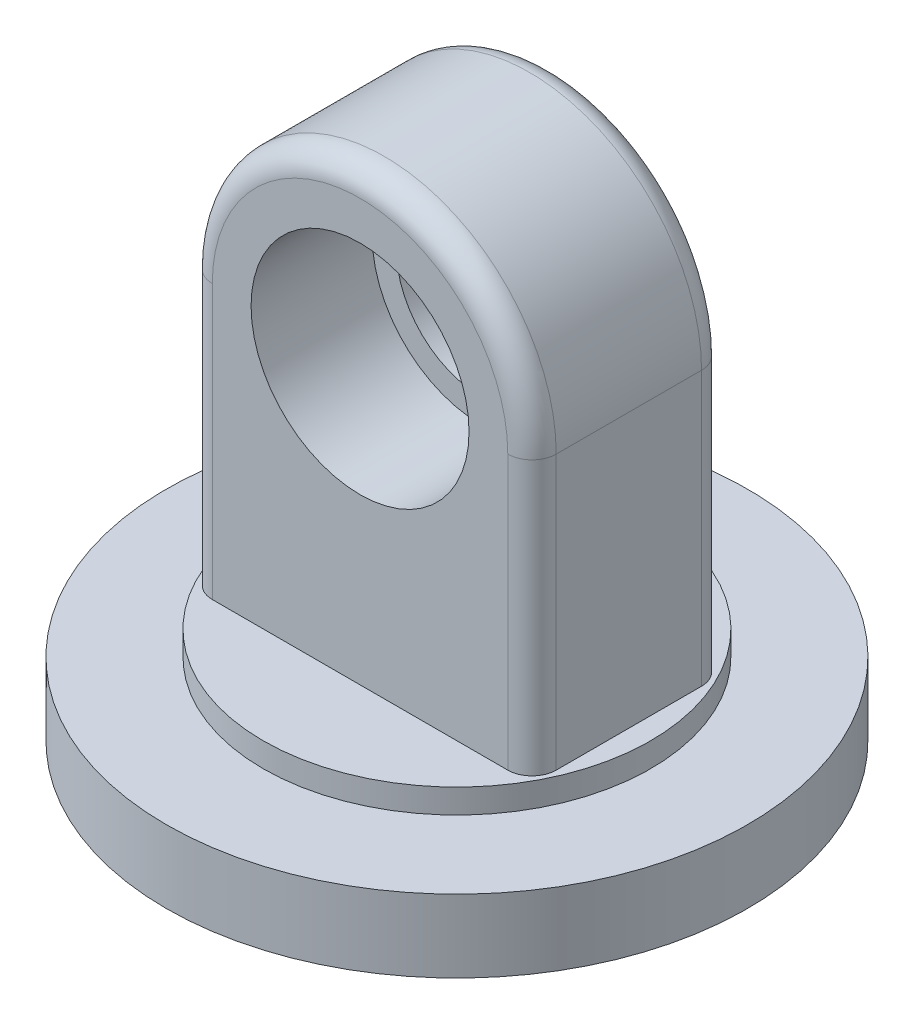
ISO-10303-21;
HEADER;
FILE_DESCRIPTION(('STEP AP214'),'2;1');
FILE_NAME('part.step','',(''),(''),'','','');
FILE_SCHEMA(('AUTOMOTIVE_DESIGN { 1 0 10303 214 1 1 1 1 }'));
ENDSEC;
DATA;
#1=APPLICATION_CONTEXT('core data for automotive mechanical design processes');
#2=APPLICATION_PROTOCOL_DEFINITION('international standard','automotive_design',2000,#1);
#3=PRODUCT_CONTEXT('',#1,'mechanical');
#4=PRODUCT('Part','Part','',(#3));
#5=PRODUCT_RELATED_PRODUCT_CATEGORY('part','',(#4));
#6=PRODUCT_DEFINITION_FORMATION('','',#4);
#7=PRODUCT_DEFINITION_CONTEXT('part definition',#1,'design');
#8=PRODUCT_DEFINITION('design','',#6,#7);
#9=PRODUCT_DEFINITION_SHAPE('','',#8);
#10=(LENGTH_UNIT() NAMED_UNIT(*) SI_UNIT(.MILLI.,.METRE.));
#11=(NAMED_UNIT(*) PLANE_ANGLE_UNIT() SI_UNIT($,.RADIAN.));
#12=(NAMED_UNIT(*) SI_UNIT($,.STERADIAN.) SOLID_ANGLE_UNIT());
#13=UNCERTAINTY_MEASURE_WITH_UNIT(LENGTH_MEASURE(1.E-05),#10,'distance_accuracy_value','');
#14=(GEOMETRIC_REPRESENTATION_CONTEXT(3) GLOBAL_UNCERTAINTY_ASSIGNED_CONTEXT((#13)) GLOBAL_UNIT_ASSIGNED_CONTEXT((#10,
#11,#12)) REPRESENTATION_CONTEXT('',''));
#15=CARTESIAN_POINT('',(0.,0.,0.));
#16=DIRECTION('',(0.,0.,1.));
#17=DIRECTION('',(1.,0.,0.));
#18=AXIS2_PLACEMENT_3D('',#15,#16,#17);
#19=CARTESIAN_POINT('',(0.,7.65,2.));
#20=DIRECTION('',(0.,0.,-1.));
#21=DIRECTION('',(-1.,0.,0.));
#22=AXIS2_PLACEMENT_3D('',#19,#20,#21);
#23=CYLINDRICAL_SURFACE('',#22,1.75);
#24=CARTESIAN_POINT('',(0.,7.65,-2.));
#25=DIRECTION('',(0.,0.,1.));
#26=DIRECTION('',(1.,0.,0.));
#27=AXIS2_PLACEMENT_3D('',#24,#25,#26);
#28=CIRCLE('',#27,1.75);
#29=CARTESIAN_POINT('',(1.75,7.65,-2.));
#30=VERTEX_POINT('',#29);
#31=EDGE_CURVE('E155',#30,#30,#28,.T.);
#32=ORIENTED_EDGE('',*,*,#31,.F.);
#33=EDGE_LOOP('',(#32));
#34=FACE_BOUND('',#33,.T.);
#35=CARTESIAN_POINT('',(0.,7.65,-0.5));
#36=DIRECTION('',(0.,0.,1.));
#37=DIRECTION('',(1.,0.,0.));
#38=AXIS2_PLACEMENT_3D('',#35,#36,#37);
#39=CIRCLE('',#38,1.75);
#40=CARTESIAN_POINT('',(1.75,7.65,-0.5));
#41=VERTEX_POINT('',#40);
#42=EDGE_CURVE('E151',#41,#41,#39,.T.);
#43=ORIENTED_EDGE('',*,*,#42,.T.);
#44=EDGE_LOOP('',(#43));
#45=FACE_BOUND('',#44,.T.);
#46=ADVANCED_FACE('F35',(#34,#45),#23,.F.);
#47=CARTESIAN_POINT('',(0.,1.5,0.));
#48=DIRECTION('',(0.,-1.,0.));
#49=DIRECTION('',(0.,0.,-1.));
#50=AXIS2_PLACEMENT_3D('',#47,#48,#49);
#51=CYLINDRICAL_SURFACE('',#50,6.);
#52=CARTESIAN_POINT('',(0.,1.5,0.));
#53=DIRECTION('',(0.,1.,0.));
#54=DIRECTION('',(0.,0.,1.));
#55=AXIS2_PLACEMENT_3D('',#52,#53,#54);
#56=CIRCLE('',#55,6.);
#57=CARTESIAN_POINT('',(0.,1.5,6.));
#58=VERTEX_POINT('',#57);
#59=EDGE_CURVE('E192',#58,#58,#56,.T.);
#60=ORIENTED_EDGE('',*,*,#59,.F.);
#61=EDGE_LOOP('',(#60));
#62=FACE_BOUND('',#61,.T.);
#63=CARTESIAN_POINT('',(0.,0.,0.));
#64=DIRECTION('',(0.,1.,0.));
#65=DIRECTION('',(0.,0.,1.));
#66=AXIS2_PLACEMENT_3D('',#63,#64,#65);
#67=CIRCLE('',#66,6.);
#68=CARTESIAN_POINT('',(0.,0.,6.));
#69=VERTEX_POINT('',#68);
#70=EDGE_CURVE('E189',#69,#69,#67,.T.);
#71=ORIENTED_EDGE('',*,*,#70,.T.);
#72=EDGE_LOOP('',(#71));
#73=FACE_BOUND('',#72,.T.);
#74=ADVANCED_FACE('F242',(#62,#73),#51,.T.);
#75=CARTESIAN_POINT('',(0.,1.5,0.));
#76=DIRECTION('',(0.,1.,0.));
#77=DIRECTION('',(0.,0.,1.));
#78=AXIS2_PLACEMENT_3D('',#75,#76,#77);
#79=PLANE('',#78);
#80=CARTESIAN_POINT('',(0.,1.5,0.));
#81=DIRECTION('',(0.,1.,0.));
#82=DIRECTION('',(0.,0.,1.));
#83=AXIS2_PLACEMENT_3D('',#80,#81,#82);
#84=CIRCLE('',#83,4.);
#85=CARTESIAN_POINT('',(0.,1.5,4.));
#86=VERTEX_POINT('',#85);
#87=EDGE_CURVE('E186',#86,#86,#84,.T.);
#88=ORIENTED_EDGE('',*,*,#87,.F.);
#89=EDGE_LOOP('',(#88));
#90=FACE_BOUND('',#89,.T.);
#91=ORIENTED_EDGE('',*,*,#59,.T.);
#92=EDGE_LOOP('',(#91));
#93=FACE_BOUND('',#92,.T.);
#94=ADVANCED_FACE('F248',(#90,#93),#79,.T.);
#95=CARTESIAN_POINT('',(0.,0.,0.));
#96=DIRECTION('',(0.,1.,0.));
#97=DIRECTION('',(0.,0.,1.));
#98=AXIS2_PLACEMENT_3D('',#95,#96,#97);
#99=PLANE('',#98);
#100=CARTESIAN_POINT('',(0.,0.,0.));
#101=DIRECTION('',(0.,-1.,0.));
#102=DIRECTION('',(0.,0.,-1.));
#103=AXIS2_PLACEMENT_3D('',#100,#101,#102);
#104=CIRCLE('',#103,4.5);
#105=CARTESIAN_POINT('',(0.,0.,-4.5));
#106=VERTEX_POINT('',#105);
#107=EDGE_CURVE('E167',#106,#106,#104,.T.);
#108=ORIENTED_EDGE('',*,*,#107,.F.);
#109=EDGE_LOOP('',(#108));
#110=FACE_BOUND('',#109,.T.);
#111=ORIENTED_EDGE('',*,*,#70,.F.);
#112=EDGE_LOOP('',(#111));
#113=FACE_BOUND('',#112,.T.);
#114=ADVANCED_FACE('F290',(#110,#113),#99,.F.);
#115=CARTESIAN_POINT('',(0.,2.,0.));
#116=DIRECTION('',(0.,-1.,0.));
#117=DIRECTION('',(0.,0.,-1.));
#118=AXIS2_PLACEMENT_3D('',#115,#116,#117);
#119=CYLINDRICAL_SURFACE('',#118,4.);
#120=CARTESIAN_POINT('',(0.,2.,0.));
#121=DIRECTION('',(0.,1.,0.));
#122=DIRECTION('',(0.,0.,1.));
#123=AXIS2_PLACEMENT_3D('',#120,#121,#122);
#124=CIRCLE('',#123,4.);
#125=CARTESIAN_POINT('',(0.,2.,4.));
#126=VERTEX_POINT('',#125);
#127=EDGE_CURVE('E183',#126,#126,#124,.T.);
#128=ORIENTED_EDGE('',*,*,#127,.F.);
#129=EDGE_LOOP('',(#128));
#130=FACE_BOUND('',#129,.T.);
#131=ORIENTED_EDGE('',*,*,#87,.T.);
#132=EDGE_LOOP('',(#131));
#133=FACE_BOUND('',#132,.T.);
#134=ADVANCED_FACE('F286',(#130,#133),#119,.T.);
#135=CARTESIAN_POINT('',(0.,2.,0.));
#136=DIRECTION('',(0.,1.,0.));
#137=DIRECTION('',(0.,0.,1.));
#138=AXIS2_PLACEMENT_3D('',#135,#136,#137);
#139=PLANE('',#138);
#140=ORIENTED_EDGE('',*,*,#127,.T.);
#141=EDGE_LOOP('',(#140));
#142=FACE_BOUND('',#141,.T.);
#143=DIRECTION('',(1.,0.,0.));
#144=VECTOR('',#143,1.);
#145=CARTESIAN_POINT('',(-3.55,2.,2.));
#146=LINE('',#145,#144);
#147=CARTESIAN_POINT('',(-3.05,2.,2.));
#148=VERTEX_POINT('',#147);
#149=CARTESIAN_POINT('',(3.05,2.,2.));
#150=VERTEX_POINT('',#149);
#151=EDGE_CURVE('E159',#148,#150,#146,.T.);
#152=ORIENTED_EDGE('',*,*,#151,.F.);
#153=CARTESIAN_POINT('',(-3.05,2.,1.5));
#154=DIRECTION('',(0.,1.,0.));
#155=DIRECTION('',(0.,0.,1.));
#156=AXIS2_PLACEMENT_3D('',#153,#154,#155);
#157=CIRCLE('',#156,0.5);
#158=CARTESIAN_POINT('',(-3.55,2.,1.5));
#159=VERTEX_POINT('',#158);
#160=EDGE_CURVE('E124',#148,#159,#157,.F.);
#161=ORIENTED_EDGE('',*,*,#160,.T.);
#162=DIRECTION('',(0.,0.,-1.));
#163=VECTOR('',#162,1.);
#164=CARTESIAN_POINT('',(-3.55,2.,2.));
#165=LINE('',#164,#163);
#166=CARTESIAN_POINT('',(-3.55,2.,-1.5));
#167=VERTEX_POINT('',#166);
#168=EDGE_CURVE('E162',#159,#167,#165,.T.);
#169=ORIENTED_EDGE('',*,*,#168,.T.);
#170=CARTESIAN_POINT('',(-3.05,2.,-1.5));
#171=DIRECTION('',(0.,1.,0.));
#172=DIRECTION('',(0.,0.,1.));
#173=AXIS2_PLACEMENT_3D('',#170,#171,#172);
#174=CIRCLE('',#173,0.5);
#175=CARTESIAN_POINT('',(-3.05,2.,-2.));
#176=VERTEX_POINT('',#175);
#177=EDGE_CURVE('E83',#167,#176,#174,.F.);
#178=ORIENTED_EDGE('',*,*,#177,.T.);
#179=DIRECTION('',(1.,0.,0.));
#180=VECTOR('',#179,1.);
#181=CARTESIAN_POINT('',(-3.55,2.,-2.));
#182=LINE('',#181,#180);
#183=CARTESIAN_POINT('',(3.05,2.,-2.));
#184=VERTEX_POINT('',#183);
#185=EDGE_CURVE('E163',#176,#184,#182,.T.);
#186=ORIENTED_EDGE('',*,*,#185,.T.);
#187=CARTESIAN_POINT('',(3.05,2.,-1.5));
#188=DIRECTION('',(0.,1.,0.));
#189=DIRECTION('',(0.,0.,1.));
#190=AXIS2_PLACEMENT_3D('',#187,#188,#189);
#191=CIRCLE('',#190,0.5);
#192=CARTESIAN_POINT('',(3.55,2.,-1.5));
#193=VERTEX_POINT('',#192);
#194=EDGE_CURVE('E45',#184,#193,#191,.F.);
#195=ORIENTED_EDGE('',*,*,#194,.T.);
#196=DIRECTION('',(0.,0.,-1.));
#197=VECTOR('',#196,1.);
#198=CARTESIAN_POINT('',(3.55,2.,2.));
#199=LINE('',#198,#197);
#200=CARTESIAN_POINT('',(3.55,2.,1.5));
#201=VERTEX_POINT('',#200);
#202=EDGE_CURVE('E161',#201,#193,#199,.T.);
#203=ORIENTED_EDGE('',*,*,#202,.F.);
#204=CARTESIAN_POINT('',(3.05,2.,1.5));
#205=DIRECTION('',(0.,1.,0.));
#206=DIRECTION('',(0.,0.,1.));
#207=AXIS2_PLACEMENT_3D('',#204,#205,#206);
#208=CIRCLE('',#207,0.5);
#209=EDGE_CURVE('E11',#201,#150,#208,.F.);
#210=ORIENTED_EDGE('',*,*,#209,.T.);
#211=EDGE_LOOP('',(#152,#161,#169,#178,#186,#195,#203,#210));
#212=FACE_BOUND('',#211,.T.);
#213=ADVANCED_FACE('F226',(#142,#212),#139,.T.);
#214=CARTESIAN_POINT('',(0.,-0.5,0.));
#215=DIRECTION('',(0.,1.,0.));
#216=DIRECTION('',(0.,0.,1.));
#217=AXIS2_PLACEMENT_3D('',#214,#215,#216);
#218=CYLINDRICAL_SURFACE('',#217,4.5);
#219=CARTESIAN_POINT('',(0.,-0.5,0.));
#220=DIRECTION('',(0.,-1.,0.));
#221=DIRECTION('',(0.,0.,-1.));
#222=AXIS2_PLACEMENT_3D('',#219,#220,#221);
#223=CIRCLE('',#222,4.5);
#224=CARTESIAN_POINT('',(0.,-0.5,-4.5));
#225=VERTEX_POINT('',#224);
#226=EDGE_CURVE('E178',#225,#225,#223,.T.);
#227=ORIENTED_EDGE('',*,*,#226,.F.);
#228=EDGE_LOOP('',(#227));
#229=FACE_BOUND('',#228,.T.);
#230=ORIENTED_EDGE('',*,*,#107,.T.);
#231=EDGE_LOOP('',(#230));
#232=FACE_BOUND('',#231,.T.);
#233=ADVANCED_FACE('F279',(#229,#232),#218,.T.);
#234=CARTESIAN_POINT('',(0.,-0.5,0.));
#235=DIRECTION('',(0.,-1.,0.));
#236=DIRECTION('',(0.,0.,-1.));
#237=AXIS2_PLACEMENT_3D('',#234,#235,#236);
#238=PLANE('',#237);
#239=CARTESIAN_POINT('',(0.,-0.5,0.));
#240=DIRECTION('',(0.,-1.,0.));
#241=DIRECTION('',(0.,0.,-1.));
#242=AXIS2_PLACEMENT_3D('',#239,#240,#241);
#243=CIRCLE('',#242,3.5);
#244=CARTESIAN_POINT('',(0.,-0.5,-3.5));
#245=VERTEX_POINT('',#244);
#246=EDGE_CURVE('E173',#245,#245,#243,.T.);
#247=ORIENTED_EDGE('',*,*,#246,.F.);
#248=EDGE_LOOP('',(#247));
#249=FACE_BOUND('',#248,.T.);
#250=ORIENTED_EDGE('',*,*,#226,.T.);
#251=EDGE_LOOP('',(#250));
#252=FACE_BOUND('',#251,.T.);
#253=ADVANCED_FACE('F275',(#249,#252),#238,.T.);
#254=CARTESIAN_POINT('',(0.,0.,0.));
#255=DIRECTION('',(0.,-1.,0.));
#256=DIRECTION('',(0.,0.,-1.));
#257=AXIS2_PLACEMENT_3D('',#254,#255,#256);
#258=CYLINDRICAL_SURFACE('',#257,3.5);
#259=CARTESIAN_POINT('',(0.,0.,0.));
#260=DIRECTION('',(0.,-1.,0.));
#261=DIRECTION('',(0.,0.,-1.));
#262=AXIS2_PLACEMENT_3D('',#259,#260,#261);
#263=CIRCLE('',#262,3.5);
#264=CARTESIAN_POINT('',(0.,0.,-3.5));
#265=VERTEX_POINT('',#264);
#266=EDGE_CURVE('E175',#265,#265,#263,.T.);
#267=ORIENTED_EDGE('',*,*,#266,.F.);
#268=EDGE_LOOP('',(#267));
#269=FACE_BOUND('',#268,.T.);
#270=ORIENTED_EDGE('',*,*,#246,.T.);
#271=EDGE_LOOP('',(#270));
#272=FACE_BOUND('',#271,.T.);
#273=ADVANCED_FACE('F271',(#269,#272),#258,.F.);
#274=CARTESIAN_POINT('',(0.,0.,0.));
#275=DIRECTION('',(0.,-1.,0.));
#276=DIRECTION('',(0.,0.,-1.));
#277=AXIS2_PLACEMENT_3D('',#274,#275,#276);
#278=PLANE('',#277);
#279=CARTESIAN_POINT('',(0.,0.,0.));
#280=DIRECTION('',(0.,-1.,0.));
#281=DIRECTION('',(0.,0.,-1.));
#282=AXIS2_PLACEMENT_3D('',#279,#280,#281);
#283=CIRCLE('',#282,1.2);
#284=CARTESIAN_POINT('',(0.,0.,-1.2));
#285=VERTEX_POINT('',#284);
#286=EDGE_CURVE('E470',#285,#285,#283,.T.);
#287=ORIENTED_EDGE('',*,*,#286,.F.);
#288=EDGE_LOOP('',(#287));
#289=FACE_BOUND('',#288,.T.);
#290=ORIENTED_EDGE('',*,*,#266,.T.);
#291=EDGE_LOOP('',(#290));
#292=FACE_BOUND('',#291,.T.);
#293=ADVANCED_FACE('F259',(#289,#292),#278,.T.);
#294=CARTESIAN_POINT('',(0.,7.65,2.));
#295=DIRECTION('',(0.,0.,-1.));
#296=DIRECTION('',(-1.,0.,0.));
#297=AXIS2_PLACEMENT_3D('',#294,#295,#296);
#298=PLANE('',#297);
#299=CARTESIAN_POINT('',(0.,7.65,2.));
#300=DIRECTION('',(0.,0.,1.));
#301=DIRECTION('',(1.,0.,0.));
#302=AXIS2_PLACEMENT_3D('',#299,#300,#301);
#303=CIRCLE('',#302,2.25);
#304=CARTESIAN_POINT('',(2.25,7.65,2.));
#305=VERTEX_POINT('',#304);
#306=EDGE_CURVE('E140',#305,#305,#303,.T.);
#307=ORIENTED_EDGE('',*,*,#306,.F.);
#308=EDGE_LOOP('',(#307));
#309=FACE_BOUND('',#308,.T.);
#310=CARTESIAN_POINT('',(0.,7.65,2.));
#311=DIRECTION('',(0.,0.,-1.));
#312=DIRECTION('',(-1.,0.,0.));
#313=AXIS2_PLACEMENT_3D('',#310,#311,#312);
#314=CIRCLE('',#313,3.05);
#315=CARTESIAN_POINT('',(3.05,7.65,2.));
#316=VERTEX_POINT('',#315);
#317=CARTESIAN_POINT('',(-3.05,7.65,2.));
#318=VERTEX_POINT('',#317);
#319=EDGE_CURVE('E105',#316,#318,#314,.F.);
#320=ORIENTED_EDGE('',*,*,#319,.T.);
#321=DIRECTION('',(0.,-1.,0.));
#322=VECTOR('',#321,1.);
#323=CARTESIAN_POINT('',(-3.05,7.65,2.));
#324=LINE('',#323,#322);
#325=EDGE_CURVE('E109',#318,#148,#324,.T.);
#326=ORIENTED_EDGE('',*,*,#325,.T.);
#327=ORIENTED_EDGE('',*,*,#151,.T.);
#328=DIRECTION('',(0.,1.,0.));
#329=VECTOR('',#328,1.);
#330=CARTESIAN_POINT('',(3.05,7.65,2.));
#331=LINE('',#330,#329);
#332=EDGE_CURVE('E101',#150,#316,#331,.T.);
#333=ORIENTED_EDGE('',*,*,#332,.T.);
#334=EDGE_LOOP('',(#320,#326,#327,#333));
#335=FACE_BOUND('',#334,.T.);
#336=ADVANCED_FACE('F107',(#309,#335),#298,.F.);
#337=CARTESIAN_POINT('',(0.,7.65,-2.));
#338=DIRECTION('',(0.,0.,-1.));
#339=DIRECTION('',(-1.,0.,0.));
#340=AXIS2_PLACEMENT_3D('',#337,#338,#339);
#341=PLANE('',#340);
#342=ORIENTED_EDGE('',*,*,#185,.F.);
#343=DIRECTION('',(0.,-1.,0.));
#344=VECTOR('',#343,1.);
#345=CARTESIAN_POINT('',(-3.05,7.65,-2.));
#346=LINE('',#345,#344);
#347=CARTESIAN_POINT('',(-3.05,7.65,-2.));
#348=VERTEX_POINT('',#347);
#349=EDGE_CURVE('E207',#176,#348,#346,.F.);
#350=ORIENTED_EDGE('',*,*,#349,.T.);
#351=CARTESIAN_POINT('',(0.,7.65,-2.));
#352=DIRECTION('',(0.,0.,-1.));
#353=DIRECTION('',(-1.,0.,0.));
#354=AXIS2_PLACEMENT_3D('',#351,#352,#353);
#355=CIRCLE('',#354,3.05);
#356=CARTESIAN_POINT('',(3.05,7.65,-2.));
#357=VERTEX_POINT('',#356);
#358=EDGE_CURVE('E205',#348,#357,#355,.T.);
#359=ORIENTED_EDGE('',*,*,#358,.T.);
#360=DIRECTION('',(0.,1.,0.));
#361=VECTOR('',#360,1.);
#362=CARTESIAN_POINT('',(3.05,2.,-2.));
#363=LINE('',#362,#361);
#364=EDGE_CURVE('E76',#357,#184,#363,.F.);
#365=ORIENTED_EDGE('',*,*,#364,.T.);
#366=EDGE_LOOP('',(#342,#350,#359,#365));
#367=FACE_BOUND('',#366,.T.);
#368=ORIENTED_EDGE('',*,*,#31,.T.);
#369=EDGE_LOOP('',(#368));
#370=FACE_BOUND('',#369,.T.);
#371=ADVANCED_FACE('F224',(#367,#370),#341,.T.);
#372=CARTESIAN_POINT('',(3.55,7.65,2.));
#373=DIRECTION('',(-1.,0.,0.));
#374=DIRECTION('',(0.,0.,1.));
#375=AXIS2_PLACEMENT_3D('',#372,#373,#374);
#376=PLANE('',#375);
#377=ORIENTED_EDGE('',*,*,#202,.T.);
#378=DIRECTION('',(0.,1.,0.));
#379=VECTOR('',#378,1.);
#380=CARTESIAN_POINT('',(3.55,7.65,-1.5));
#381=LINE('',#380,#379);
#382=CARTESIAN_POINT('',(3.55,7.65,-1.5));
#383=VERTEX_POINT('',#382);
#384=EDGE_CURVE('E127',#193,#383,#381,.T.);
#385=ORIENTED_EDGE('',*,*,#384,.T.);
#386=DIRECTION('',(0.,0.,-1.));
#387=VECTOR('',#386,1.);
#388=CARTESIAN_POINT('',(3.55,7.65,2.));
#389=LINE('',#388,#387);
#390=CARTESIAN_POINT('',(3.55,7.65,1.5));
#391=VERTEX_POINT('',#390);
#392=EDGE_CURVE('E170',#391,#383,#389,.T.);
#393=ORIENTED_EDGE('',*,*,#392,.F.);
#394=DIRECTION('',(0.,1.,0.));
#395=VECTOR('',#394,1.);
#396=CARTESIAN_POINT('',(3.55,7.65,1.5));
#397=LINE('',#396,#395);
#398=EDGE_CURVE('E125',#391,#201,#397,.F.);
#399=ORIENTED_EDGE('',*,*,#398,.T.);
#400=EDGE_LOOP('',(#377,#385,#393,#399));
#401=FACE_BOUND('',#400,.T.);
#402=ADVANCED_FACE('F231',(#401),#376,.F.);
#403=CARTESIAN_POINT('',(0.,7.65,2.));
#404=DIRECTION('',(0.,0.,-1.));
#405=DIRECTION('',(-1.,0.,0.));
#406=AXIS2_PLACEMENT_3D('',#403,#404,#405);
#407=CYLINDRICAL_SURFACE('',#406,3.55);
#408=ORIENTED_EDGE('',*,*,#392,.T.);
#409=CARTESIAN_POINT('',(0.,7.65,-1.5));
#410=DIRECTION('',(0.,0.,-1.));
#411=DIRECTION('',(-1.,0.,0.));
#412=AXIS2_PLACEMENT_3D('',#409,#410,#411);
#413=CIRCLE('',#412,3.55);
#414=CARTESIAN_POINT('',(-3.55,7.65,-1.5));
#415=VERTEX_POINT('',#414);
#416=EDGE_CURVE('E210',#383,#415,#413,.F.);
#417=ORIENTED_EDGE('',*,*,#416,.T.);
#418=DIRECTION('',(0.,0.,-1.));
#419=VECTOR('',#418,1.);
#420=CARTESIAN_POINT('',(-3.55,7.65,2.));
#421=LINE('',#420,#419);
#422=CARTESIAN_POINT('',(-3.55,7.65,1.5));
#423=VERTEX_POINT('',#422);
#424=EDGE_CURVE('E158',#423,#415,#421,.T.);
#425=ORIENTED_EDGE('',*,*,#424,.F.);
#426=CARTESIAN_POINT('',(0.,7.65,1.5));
#427=DIRECTION('',(0.,0.,-1.));
#428=DIRECTION('',(-1.,0.,0.));
#429=AXIS2_PLACEMENT_3D('',#426,#427,#428);
#430=CIRCLE('',#429,3.55);
#431=EDGE_CURVE('E118',#423,#391,#430,.T.);
#432=ORIENTED_EDGE('',*,*,#431,.T.);
#433=EDGE_LOOP('',(#408,#417,#425,#432));
#434=FACE_BOUND('',#433,.T.);
#435=ADVANCED_FACE('F213',(#434),#407,.T.);
#436=CARTESIAN_POINT('',(-3.55,2.,2.));
#437=DIRECTION('',(1.,0.,0.));
#438=DIRECTION('',(0.,0.,-1.));
#439=AXIS2_PLACEMENT_3D('',#436,#437,#438);
#440=PLANE('',#439);
#441=ORIENTED_EDGE('',*,*,#424,.T.);
#442=DIRECTION('',(0.,-1.,0.));
#443=VECTOR('',#442,1.);
#444=CARTESIAN_POINT('',(-3.55,2.,-1.5));
#445=LINE('',#444,#443);
#446=EDGE_CURVE('E201',#415,#167,#445,.T.);
#447=ORIENTED_EDGE('',*,*,#446,.T.);
#448=ORIENTED_EDGE('',*,*,#168,.F.);
#449=DIRECTION('',(0.,-1.,0.));
#450=VECTOR('',#449,1.);
#451=CARTESIAN_POINT('',(-3.55,2.,1.5));
#452=LINE('',#451,#450);
#453=EDGE_CURVE('E165',#159,#423,#452,.F.);
#454=ORIENTED_EDGE('',*,*,#453,.T.);
#455=EDGE_LOOP('',(#441,#447,#448,#454));
#456=FACE_BOUND('',#455,.T.);
#457=ADVANCED_FACE('F217',(#456),#440,.F.);
#458=CARTESIAN_POINT('',(0.,7.65,-0.5));
#459=DIRECTION('',(0.,0.,1.));
#460=DIRECTION('',(1.,0.,0.));
#461=AXIS2_PLACEMENT_3D('',#458,#459,#460);
#462=CYLINDRICAL_SURFACE('',#461,2.25);
#463=CARTESIAN_POINT('',(0.,7.65,-0.5));
#464=DIRECTION('',(0.,0.,1.));
#465=DIRECTION('',(1.,0.,0.));
#466=AXIS2_PLACEMENT_3D('',#463,#464,#465);
#467=CIRCLE('',#466,2.25);
#468=CARTESIAN_POINT('',(2.25,7.65,-0.5));
#469=VERTEX_POINT('',#468);
#470=EDGE_CURVE('E146',#469,#469,#467,.T.);
#471=ORIENTED_EDGE('',*,*,#470,.F.);
#472=EDGE_LOOP('',(#471));
#473=FACE_BOUND('',#472,.T.);
#474=ORIENTED_EDGE('',*,*,#306,.T.);
#475=EDGE_LOOP('',(#474));
#476=FACE_BOUND('',#475,.T.);
#477=ADVANCED_FACE('F255',(#473,#476),#462,.F.);
#478=CARTESIAN_POINT('',(0.,7.65,-0.5));
#479=DIRECTION('',(0.,0.,1.));
#480=DIRECTION('',(1.,0.,0.));
#481=AXIS2_PLACEMENT_3D('',#478,#479,#480);
#482=PLANE('',#481);
#483=ORIENTED_EDGE('',*,*,#42,.F.);
#484=EDGE_LOOP('',(#483));
#485=FACE_BOUND('',#484,.T.);
#486=ORIENTED_EDGE('',*,*,#470,.T.);
#487=EDGE_LOOP('',(#486));
#488=FACE_BOUND('',#487,.T.);
#489=ADVANCED_FACE('F302',(#485,#488),#482,.T.);
#490=CARTESIAN_POINT('',(3.05,7.65,-1.5));
#491=DIRECTION('',(0.,-1.,0.));
#492=DIRECTION('',(0.,0.,-1.));
#493=AXIS2_PLACEMENT_3D('',#490,#491,#492);
#494=CYLINDRICAL_SURFACE('',#493,0.5);
#495=ORIENTED_EDGE('',*,*,#194,.F.);
#496=ORIENTED_EDGE('',*,*,#364,.F.);
#497=CARTESIAN_POINT('',(3.05,7.65,-1.5));
#498=DIRECTION('',(0.,1.,0.));
#499=DIRECTION('',(0.,0.,1.));
#500=AXIS2_PLACEMENT_3D('',#497,#498,#499);
#501=CIRCLE('',#500,0.5);
#502=EDGE_CURVE('E138',#383,#357,#501,.T.);
#503=ORIENTED_EDGE('',*,*,#502,.F.);
#504=ORIENTED_EDGE('',*,*,#384,.F.);
#505=EDGE_LOOP('',(#495,#496,#503,#504));
#506=FACE_BOUND('',#505,.T.);
#507=ADVANCED_FACE('F229',(#506),#494,.T.);
#508=CARTESIAN_POINT('',(0.,7.65,-1.5));
#509=DIRECTION('',(0.,0.,-1.));
#510=DIRECTION('',(-1.,0.,0.));
#511=AXIS2_PLACEMENT_3D('',#508,#509,#510);
#512=TOROIDAL_SURFACE('',#511,3.05,0.5);
#513=ORIENTED_EDGE('',*,*,#502,.T.);
#514=ORIENTED_EDGE('',*,*,#358,.F.);
#515=CARTESIAN_POINT('',(-3.05,7.65,-1.5));
#516=DIRECTION('',(0.,-1.,0.));
#517=DIRECTION('',(0.,0.,-1.));
#518=AXIS2_PLACEMENT_3D('',#515,#516,#517);
#519=CIRCLE('',#518,0.5);
#520=EDGE_CURVE('E135',#415,#348,#519,.T.);
#521=ORIENTED_EDGE('',*,*,#520,.F.);
#522=ORIENTED_EDGE('',*,*,#416,.F.);
#523=EDGE_LOOP('',(#513,#514,#521,#522));
#524=FACE_BOUND('',#523,.T.);
#525=ADVANCED_FACE('F220',(#524),#512,.T.);
#526=CARTESIAN_POINT('',(-3.05,2.,-1.5));
#527=DIRECTION('',(0.,1.,0.));
#528=DIRECTION('',(0.,0.,1.));
#529=AXIS2_PLACEMENT_3D('',#526,#527,#528);
#530=CYLINDRICAL_SURFACE('',#529,0.5);
#531=ORIENTED_EDGE('',*,*,#520,.T.);
#532=ORIENTED_EDGE('',*,*,#349,.F.);
#533=ORIENTED_EDGE('',*,*,#177,.F.);
#534=ORIENTED_EDGE('',*,*,#446,.F.);
#535=EDGE_LOOP('',(#531,#532,#533,#534));
#536=FACE_BOUND('',#535,.T.);
#537=ADVANCED_FACE('F223',(#536),#530,.T.);
#538=CARTESIAN_POINT('',(3.05,7.65,1.5));
#539=DIRECTION('',(0.,1.,0.));
#540=DIRECTION('',(0.,0.,1.));
#541=AXIS2_PLACEMENT_3D('',#538,#539,#540);
#542=CYLINDRICAL_SURFACE('',#541,0.5);
#543=ORIENTED_EDGE('',*,*,#209,.F.);
#544=ORIENTED_EDGE('',*,*,#398,.F.);
#545=CARTESIAN_POINT('',(3.05,7.65,1.5));
#546=DIRECTION('',(0.,1.,0.));
#547=DIRECTION('',(0.,0.,1.));
#548=AXIS2_PLACEMENT_3D('',#545,#546,#547);
#549=CIRCLE('',#548,0.5);
#550=EDGE_CURVE('E39',#316,#391,#549,.T.);
#551=ORIENTED_EDGE('',*,*,#550,.F.);
#552=ORIENTED_EDGE('',*,*,#332,.F.);
#553=EDGE_LOOP('',(#543,#544,#551,#552));
#554=FACE_BOUND('',#553,.T.);
#555=ADVANCED_FACE('F37',(#554),#542,.T.);
#556=CARTESIAN_POINT('',(0.,7.65,1.5));
#557=DIRECTION('',(0.,0.,-1.));
#558=DIRECTION('',(-1.,0.,0.));
#559=AXIS2_PLACEMENT_3D('',#556,#557,#558);
#560=TOROIDAL_SURFACE('',#559,3.05,0.5);
#561=ORIENTED_EDGE('',*,*,#550,.T.);
#562=ORIENTED_EDGE('',*,*,#431,.F.);
#563=CARTESIAN_POINT('',(-3.05,7.65,1.5));
#564=DIRECTION('',(0.,-1.,0.));
#565=DIRECTION('',(0.,0.,-1.));
#566=AXIS2_PLACEMENT_3D('',#563,#564,#565);
#567=CIRCLE('',#566,0.5);
#568=EDGE_CURVE('E116',#318,#423,#567,.T.);
#569=ORIENTED_EDGE('',*,*,#568,.F.);
#570=ORIENTED_EDGE('',*,*,#319,.F.);
#571=EDGE_LOOP('',(#561,#562,#569,#570));
#572=FACE_BOUND('',#571,.T.);
#573=ADVANCED_FACE('F117',(#572),#560,.T.);
#574=CARTESIAN_POINT('',(-3.05,7.65,1.5));
#575=DIRECTION('',(0.,-1.,0.));
#576=DIRECTION('',(0.,0.,-1.));
#577=AXIS2_PLACEMENT_3D('',#574,#575,#576);
#578=CYLINDRICAL_SURFACE('',#577,0.5);
#579=ORIENTED_EDGE('',*,*,#568,.T.);
#580=ORIENTED_EDGE('',*,*,#453,.F.);
#581=ORIENTED_EDGE('',*,*,#160,.F.);
#582=ORIENTED_EDGE('',*,*,#325,.F.);
#583=EDGE_LOOP('',(#579,#580,#581,#582));
#584=FACE_BOUND('',#583,.T.);
#585=ADVANCED_FACE('F122',(#584),#578,.T.);
#586=CARTESIAN_POINT('',(0.,2.4,0.));
#587=DIRECTION('',(0.,-1.,0.));
#588=DIRECTION('',(0.,0.,-1.));
#589=AXIS2_PLACEMENT_3D('',#586,#587,#588);
#590=CYLINDRICAL_SURFACE('',#589,1.2);
#591=CARTESIAN_POINT('',(0.,2.4,0.));
#592=DIRECTION('',(0.,-1.,0.));
#593=DIRECTION('',(0.,0.,-1.));
#594=AXIS2_PLACEMENT_3D('',#591,#592,#593);
#595=CIRCLE('',#594,1.2);
#596=CARTESIAN_POINT('',(0.,2.4,-1.2));
#597=VERTEX_POINT('',#596);
#598=EDGE_CURVE('E121',#597,#597,#595,.T.);
#599=ORIENTED_EDGE('',*,*,#598,.F.);
#600=EDGE_LOOP('',(#599));
#601=FACE_BOUND('',#600,.T.);
#602=ORIENTED_EDGE('',*,*,#286,.T.);
#603=EDGE_LOOP('',(#602));
#604=FACE_BOUND('',#603,.T.);
#605=ADVANCED_FACE('F304',(#601,#604),#590,.F.);
#606=CARTESIAN_POINT('',(0.,2.4,0.));
#607=DIRECTION('',(0.,-1.,0.));
#608=DIRECTION('',(0.,0.,-1.));
#609=AXIS2_PLACEMENT_3D('',#606,#607,#608);
#610=PLANE('',#609);
#611=ORIENTED_EDGE('',*,*,#598,.T.);
#612=EDGE_LOOP('',(#611));
#613=FACE_BOUND('',#612,.T.);
#614=ADVANCED_FACE('F308',(#613),#610,.T.);
#615=CLOSED_SHELL('',(#46,#74,#94,#114,#134,#213,#233,#253,#273,#293,#336,#371,#402,#435,#457,
#477,#489,#507,#525,#537,#555,#573,#585,#605,#614));
#616=MANIFOLD_SOLID_BREP('B2',#615);
#617=ADVANCED_BREP_SHAPE_REPRESENTATION('',(#18,#616),#14);
#618=SHAPE_DEFINITION_REPRESENTATION(#9,#617);
ENDSEC;
END-ISO-10303-21;
